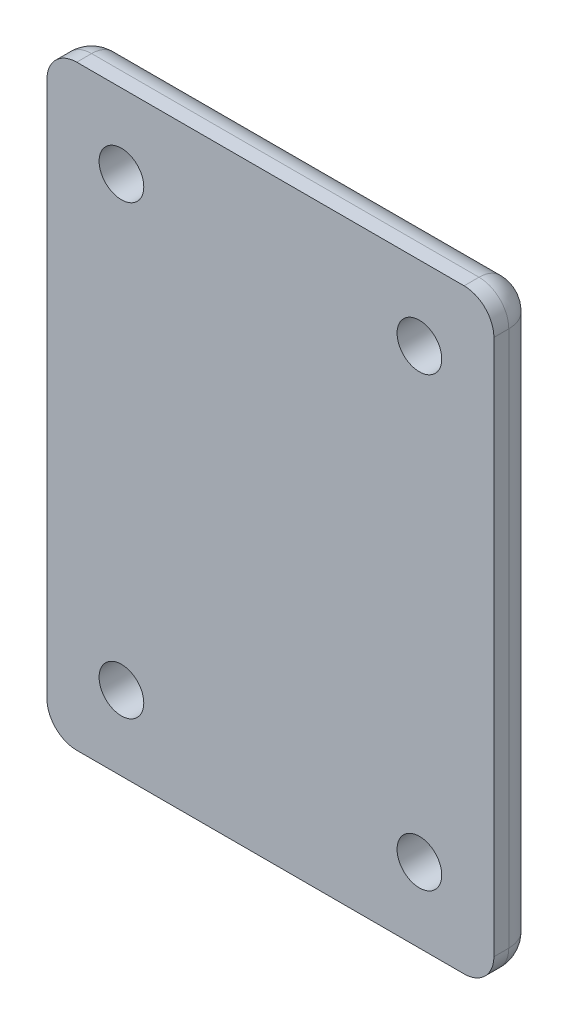
ISO-10303-21;
HEADER;
FILE_DESCRIPTION(('STEP AP214'),'2;1');
FILE_NAME('part.step','',(''),(''),'','','');
FILE_SCHEMA(('AUTOMOTIVE_DESIGN { 1 0 10303 214 1 1 1 1 }'));
ENDSEC;
DATA;
#1=APPLICATION_CONTEXT('core data for automotive mechanical design processes');
#2=APPLICATION_PROTOCOL_DEFINITION('international standard','automotive_design',2000,#1);
#3=PRODUCT_CONTEXT('',#1,'mechanical');
#4=PRODUCT('Part','Part','',(#3));
#5=PRODUCT_RELATED_PRODUCT_CATEGORY('part','',(#4));
#6=PRODUCT_DEFINITION_FORMATION('','',#4);
#7=PRODUCT_DEFINITION_CONTEXT('part definition',#1,'design');
#8=PRODUCT_DEFINITION('design','',#6,#7);
#9=PRODUCT_DEFINITION_SHAPE('','',#8);
#10=(LENGTH_UNIT() NAMED_UNIT(*) SI_UNIT(.MILLI.,.METRE.));
#11=(NAMED_UNIT(*) PLANE_ANGLE_UNIT() SI_UNIT($,.RADIAN.));
#12=(NAMED_UNIT(*) SI_UNIT($,.STERADIAN.) SOLID_ANGLE_UNIT());
#13=UNCERTAINTY_MEASURE_WITH_UNIT(LENGTH_MEASURE(1.E-05),#10,'distance_accuracy_value','');
#14=(GEOMETRIC_REPRESENTATION_CONTEXT(3) GLOBAL_UNCERTAINTY_ASSIGNED_CONTEXT((#13)) GLOBAL_UNIT_ASSIGNED_CONTEXT((#10,
#11,#12)) REPRESENTATION_CONTEXT('',''));
#15=CARTESIAN_POINT('',(0.,0.,0.));
#16=DIRECTION('',(0.,0.,1.));
#17=DIRECTION('',(1.,0.,0.));
#18=AXIS2_PLACEMENT_3D('',#15,#16,#17);
#19=CARTESIAN_POINT('',(15.,20.,3.));
#20=DIRECTION('',(-1.,0.,0.));
#21=DIRECTION('',(0.,-1.,0.));
#22=AXIS2_PLACEMENT_3D('',#19,#20,#21);
#23=PLANE('',#22);
#24=DIRECTION('',(0.,1.,0.));
#25=VECTOR('',#24,1.);
#26=CARTESIAN_POINT('',(15.,20.,3.));
#27=LINE('',#26,#25);
#28=CARTESIAN_POINT('',(15.,-18.,3.));
#29=VERTEX_POINT('',#28);
#30=CARTESIAN_POINT('',(15.,18.,3.));
#31=VERTEX_POINT('',#30);
#32=EDGE_CURVE('E125',#29,#31,#27,.T.);
#33=ORIENTED_EDGE('',*,*,#32,.F.);
#34=DIRECTION('',(0.,0.,-1.));
#35=VECTOR('',#34,1.);
#36=CARTESIAN_POINT('',(15.,-18.,3.));
#37=LINE('',#36,#35);
#38=CARTESIAN_POINT('',(15.,-18.,2.));
#39=VERTEX_POINT('',#38);
#40=EDGE_CURVE('E138',#29,#39,#37,.T.);
#41=ORIENTED_EDGE('',*,*,#40,.T.);
#42=DIRECTION('',(0.,1.,0.));
#43=VECTOR('',#42,1.);
#44=CARTESIAN_POINT('',(15.,20.,2.));
#45=LINE('',#44,#43);
#46=CARTESIAN_POINT('',(15.,18.,2.));
#47=VERTEX_POINT('',#46);
#48=EDGE_CURVE('E152',#39,#47,#45,.T.);
#49=ORIENTED_EDGE('',*,*,#48,.T.);
#50=DIRECTION('',(0.,0.,-1.));
#51=VECTOR('',#50,1.);
#52=CARTESIAN_POINT('',(15.,18.,3.));
#53=LINE('',#52,#51);
#54=EDGE_CURVE('E141',#47,#31,#53,.F.);
#55=ORIENTED_EDGE('',*,*,#54,.T.);
#56=EDGE_LOOP('',(#33,#41,#49,#55));
#57=FACE_BOUND('',#56,.T.);
#58=ADVANCED_FACE('F45',(#57),#23,.F.);
#59=CARTESIAN_POINT('',(-15.,20.,3.));
#60=DIRECTION('',(0.,-1.,0.));
#61=DIRECTION('',(0.,0.,-1.));
#62=AXIS2_PLACEMENT_3D('',#59,#60,#61);
#63=PLANE('',#62);
#64=DIRECTION('',(-1.,0.,0.));
#65=VECTOR('',#64,1.);
#66=CARTESIAN_POINT('',(-15.,20.,3.));
#67=LINE('',#66,#65);
#68=CARTESIAN_POINT('',(13.,20.,3.));
#69=VERTEX_POINT('',#68);
#70=CARTESIAN_POINT('',(-13.,20.,3.));
#71=VERTEX_POINT('',#70);
#72=EDGE_CURVE('E143',#69,#71,#67,.T.);
#73=ORIENTED_EDGE('',*,*,#72,.F.);
#74=DIRECTION('',(0.,0.,-1.));
#75=VECTOR('',#74,1.);
#76=CARTESIAN_POINT('',(13.,20.,3.));
#77=LINE('',#76,#75);
#78=CARTESIAN_POINT('',(13.,20.,2.));
#79=VERTEX_POINT('',#78);
#80=EDGE_CURVE('E11',#69,#79,#77,.T.);
#81=ORIENTED_EDGE('',*,*,#80,.T.);
#82=DIRECTION('',(-1.,0.,0.));
#83=VECTOR('',#82,1.);
#84=CARTESIAN_POINT('',(-15.,20.,2.));
#85=LINE('',#84,#83);
#86=CARTESIAN_POINT('',(-13.,20.,2.));
#87=VERTEX_POINT('',#86);
#88=EDGE_CURVE('E55',#79,#87,#85,.T.);
#89=ORIENTED_EDGE('',*,*,#88,.T.);
#90=DIRECTION('',(0.,0.,-1.));
#91=VECTOR('',#90,1.);
#92=CARTESIAN_POINT('',(-13.,20.,3.));
#93=LINE('',#92,#91);
#94=EDGE_CURVE('E195',#87,#71,#93,.F.);
#95=ORIENTED_EDGE('',*,*,#94,.T.);
#96=EDGE_LOOP('',(#73,#81,#89,#95));
#97=FACE_BOUND('',#96,.T.);
#98=ADVANCED_FACE('F308',(#97),#63,.F.);
#99=CARTESIAN_POINT('',(-15.,20.,3.));
#100=DIRECTION('',(1.,0.,0.));
#101=DIRECTION('',(0.,1.,0.));
#102=AXIS2_PLACEMENT_3D('',#99,#100,#101);
#103=PLANE('',#102);
#104=DIRECTION('',(0.,-1.,0.));
#105=VECTOR('',#104,1.);
#106=CARTESIAN_POINT('',(-15.,20.,2.));
#107=LINE('',#106,#105);
#108=CARTESIAN_POINT('',(-15.,18.,2.));
#109=VERTEX_POINT('',#108);
#110=CARTESIAN_POINT('',(-15.,-18.,2.));
#111=VERTEX_POINT('',#110);
#112=EDGE_CURVE('E189',#109,#111,#107,.T.);
#113=ORIENTED_EDGE('',*,*,#112,.T.);
#114=DIRECTION('',(0.,0.,-1.));
#115=VECTOR('',#114,1.);
#116=CARTESIAN_POINT('',(-15.,-18.,3.));
#117=LINE('',#116,#115);
#118=CARTESIAN_POINT('',(-15.,-18.,3.));
#119=VERTEX_POINT('',#118);
#120=EDGE_CURVE('E192',#111,#119,#117,.F.);
#121=ORIENTED_EDGE('',*,*,#120,.T.);
#122=DIRECTION('',(0.,-1.,0.));
#123=VECTOR('',#122,1.);
#124=CARTESIAN_POINT('',(-15.,20.,3.));
#125=LINE('',#124,#123);
#126=CARTESIAN_POINT('',(-15.,18.,3.));
#127=VERTEX_POINT('',#126);
#128=EDGE_CURVE('E267',#127,#119,#125,.T.);
#129=ORIENTED_EDGE('',*,*,#128,.F.);
#130=DIRECTION('',(0.,0.,-1.));
#131=VECTOR('',#130,1.);
#132=CARTESIAN_POINT('',(-15.,18.,3.));
#133=LINE('',#132,#131);
#134=EDGE_CURVE('E133',#127,#109,#133,.T.);
#135=ORIENTED_EDGE('',*,*,#134,.T.);
#136=EDGE_LOOP('',(#113,#121,#129,#135));
#137=FACE_BOUND('',#136,.T.);
#138=ADVANCED_FACE('F313',(#137),#103,.F.);
#139=CARTESIAN_POINT('',(-15.,-20.,3.));
#140=DIRECTION('',(0.,1.,0.));
#141=DIRECTION('',(0.,0.,1.));
#142=AXIS2_PLACEMENT_3D('',#139,#140,#141);
#143=PLANE('',#142);
#144=DIRECTION('',(1.,0.,0.));
#145=VECTOR('',#144,1.);
#146=CARTESIAN_POINT('',(-15.,-20.,2.));
#147=LINE('',#146,#145);
#148=CARTESIAN_POINT('',(-13.,-20.,2.));
#149=VERTEX_POINT('',#148);
#150=CARTESIAN_POINT('',(13.,-20.,2.));
#151=VERTEX_POINT('',#150);
#152=EDGE_CURVE('E173',#149,#151,#147,.T.);
#153=ORIENTED_EDGE('',*,*,#152,.T.);
#154=DIRECTION('',(0.,0.,-1.));
#155=VECTOR('',#154,1.);
#156=CARTESIAN_POINT('',(13.,-20.,3.));
#157=LINE('',#156,#155);
#158=CARTESIAN_POINT('',(13.,-20.,3.));
#159=VERTEX_POINT('',#158);
#160=EDGE_CURVE('E176',#151,#159,#157,.F.);
#161=ORIENTED_EDGE('',*,*,#160,.T.);
#162=DIRECTION('',(1.,0.,0.));
#163=VECTOR('',#162,1.);
#164=CARTESIAN_POINT('',(-15.,-20.,3.));
#165=LINE('',#164,#163);
#166=CARTESIAN_POINT('',(-13.,-20.,3.));
#167=VERTEX_POINT('',#166);
#168=EDGE_CURVE('E128',#167,#159,#165,.T.);
#169=ORIENTED_EDGE('',*,*,#168,.F.);
#170=DIRECTION('',(0.,0.,-1.));
#171=VECTOR('',#170,1.);
#172=CARTESIAN_POINT('',(-13.,-20.,3.));
#173=LINE('',#172,#171);
#174=EDGE_CURVE('E170',#167,#149,#173,.T.);
#175=ORIENTED_EDGE('',*,*,#174,.T.);
#176=EDGE_LOOP('',(#153,#161,#169,#175));
#177=FACE_BOUND('',#176,.T.);
#178=ADVANCED_FACE('F377',(#177),#143,.F.);
#179=CARTESIAN_POINT('',(0.,0.,3.));
#180=DIRECTION('',(0.,0.,1.));
#181=DIRECTION('',(1.,0.,0.));
#182=AXIS2_PLACEMENT_3D('',#179,#180,#181);
#183=PLANE('',#182);
#184=CARTESIAN_POINT('',(-10.,15.,3.));
#185=DIRECTION('',(0.,0.,1.));
#186=DIRECTION('',(1.,0.,0.));
#187=AXIS2_PLACEMENT_3D('',#184,#185,#186);
#188=CIRCLE('',#187,1.5);
#189=CARTESIAN_POINT('',(-8.5,15.,3.));
#190=VERTEX_POINT('',#189);
#191=EDGE_CURVE('E253',#190,#190,#188,.T.);
#192=ORIENTED_EDGE('',*,*,#191,.F.);
#193=EDGE_LOOP('',(#192));
#194=FACE_BOUND('',#193,.T.);
#195=CARTESIAN_POINT('',(10.,-15.,3.));
#196=DIRECTION('',(0.,0.,1.));
#197=DIRECTION('',(1.,0.,0.));
#198=AXIS2_PLACEMENT_3D('',#195,#196,#197);
#199=CIRCLE('',#198,1.5);
#200=CARTESIAN_POINT('',(11.5,-15.,3.));
#201=VERTEX_POINT('',#200);
#202=EDGE_CURVE('E247',#201,#201,#199,.T.);
#203=ORIENTED_EDGE('',*,*,#202,.F.);
#204=EDGE_LOOP('',(#203));
#205=FACE_BOUND('',#204,.T.);
#206=CARTESIAN_POINT('',(-10.,-15.,3.));
#207=DIRECTION('',(0.,0.,1.));
#208=DIRECTION('',(1.,0.,0.));
#209=AXIS2_PLACEMENT_3D('',#206,#207,#208);
#210=CIRCLE('',#209,1.5);
#211=CARTESIAN_POINT('',(-8.5,-15.,3.));
#212=VERTEX_POINT('',#211);
#213=EDGE_CURVE('E243',#212,#212,#210,.T.);
#214=ORIENTED_EDGE('',*,*,#213,.F.);
#215=EDGE_LOOP('',(#214));
#216=FACE_BOUND('',#215,.T.);
#217=CARTESIAN_POINT('',(10.,15.,3.));
#218=DIRECTION('',(0.,0.,1.));
#219=DIRECTION('',(1.,0.,0.));
#220=AXIS2_PLACEMENT_3D('',#217,#218,#219);
#221=CIRCLE('',#220,1.5);
#222=CARTESIAN_POINT('',(11.5,15.,3.));
#223=VERTEX_POINT('',#222);
#224=EDGE_CURVE('E258',#223,#223,#221,.T.);
#225=ORIENTED_EDGE('',*,*,#224,.F.);
#226=EDGE_LOOP('',(#225));
#227=FACE_BOUND('',#226,.T.);
#228=ORIENTED_EDGE('',*,*,#168,.T.);
#229=CARTESIAN_POINT('',(13.,-18.,3.));
#230=DIRECTION('',(0.,0.,1.));
#231=DIRECTION('',(1.,0.,0.));
#232=AXIS2_PLACEMENT_3D('',#229,#230,#231);
#233=CIRCLE('',#232,2.);
#234=EDGE_CURVE('E122',#159,#29,#233,.T.);
#235=ORIENTED_EDGE('',*,*,#234,.T.);
#236=ORIENTED_EDGE('',*,*,#32,.T.);
#237=CARTESIAN_POINT('',(13.,18.,3.));
#238=DIRECTION('',(0.,0.,1.));
#239=DIRECTION('',(1.,0.,0.));
#240=AXIS2_PLACEMENT_3D('',#237,#238,#239);
#241=CIRCLE('',#240,2.);
#242=EDGE_CURVE('E182',#31,#69,#241,.T.);
#243=ORIENTED_EDGE('',*,*,#242,.T.);
#244=ORIENTED_EDGE('',*,*,#72,.T.);
#245=CARTESIAN_POINT('',(-13.,18.,3.));
#246=DIRECTION('',(0.,0.,1.));
#247=DIRECTION('',(1.,0.,0.));
#248=AXIS2_PLACEMENT_3D('',#245,#246,#247);
#249=CIRCLE('',#248,2.);
#250=EDGE_CURVE('E179',#71,#127,#249,.T.);
#251=ORIENTED_EDGE('',*,*,#250,.T.);
#252=ORIENTED_EDGE('',*,*,#128,.T.);
#253=CARTESIAN_POINT('',(-13.,-18.,3.));
#254=DIRECTION('',(0.,0.,1.));
#255=DIRECTION('',(1.,0.,0.));
#256=AXIS2_PLACEMENT_3D('',#253,#254,#255);
#257=CIRCLE('',#256,2.);
#258=EDGE_CURVE('E134',#119,#167,#257,.T.);
#259=ORIENTED_EDGE('',*,*,#258,.T.);
#260=EDGE_LOOP('',(#228,#235,#236,#243,#244,#251,#252,#259));
#261=FACE_BOUND('',#260,.T.);
#262=ADVANCED_FACE('F124',(#194,#205,#216,#227,#261),#183,.T.);
#263=CARTESIAN_POINT('',(0.,0.,0.));
#264=DIRECTION('',(0.,0.,1.));
#265=DIRECTION('',(1.,0.,0.));
#266=AXIS2_PLACEMENT_3D('',#263,#264,#265);
#267=PLANE('',#266);
#268=DIRECTION('',(-1.,0.,0.));
#269=VECTOR('',#268,1.);
#270=CARTESIAN_POINT('',(0.,18.,0.));
#271=LINE('',#270,#269);
#272=CARTESIAN_POINT('',(-13.,18.,0.));
#273=VERTEX_POINT('',#272);
#274=CARTESIAN_POINT('',(13.,18.,0.));
#275=VERTEX_POINT('',#274);
#276=EDGE_CURVE('E151',#273,#275,#271,.F.);
#277=ORIENTED_EDGE('',*,*,#276,.T.);
#278=DIRECTION('',(0.,1.,0.));
#279=VECTOR('',#278,1.);
#280=CARTESIAN_POINT('',(13.,0.,0.));
#281=LINE('',#280,#279);
#282=CARTESIAN_POINT('',(13.,-18.,0.));
#283=VERTEX_POINT('',#282);
#284=EDGE_CURVE('E166',#275,#283,#281,.F.);
#285=ORIENTED_EDGE('',*,*,#284,.T.);
#286=DIRECTION('',(1.,0.,0.));
#287=VECTOR('',#286,1.);
#288=CARTESIAN_POINT('',(0.,-18.,0.));
#289=LINE('',#288,#287);
#290=CARTESIAN_POINT('',(-13.,-18.,0.));
#291=VERTEX_POINT('',#290);
#292=EDGE_CURVE('E163',#283,#291,#289,.F.);
#293=ORIENTED_EDGE('',*,*,#292,.T.);
#294=DIRECTION('',(0.,-1.,0.));
#295=VECTOR('',#294,1.);
#296=CARTESIAN_POINT('',(-13.,0.,0.));
#297=LINE('',#296,#295);
#298=EDGE_CURVE('E156',#291,#273,#297,.F.);
#299=ORIENTED_EDGE('',*,*,#298,.T.);
#300=EDGE_LOOP('',(#277,#285,#293,#299));
#301=FACE_BOUND('',#300,.T.);
#302=CARTESIAN_POINT('',(-10.,15.,0.));
#303=DIRECTION('',(0.,0.,1.));
#304=DIRECTION('',(1.,0.,0.));
#305=AXIS2_PLACEMENT_3D('',#302,#303,#304);
#306=CIRCLE('',#305,1.5);
#307=CARTESIAN_POINT('',(-8.5,15.,0.));
#308=VERTEX_POINT('',#307);
#309=EDGE_CURVE('E144',#308,#308,#306,.T.);
#310=ORIENTED_EDGE('',*,*,#309,.T.);
#311=EDGE_LOOP('',(#310));
#312=FACE_BOUND('',#311,.T.);
#313=CARTESIAN_POINT('',(10.,-15.,0.));
#314=DIRECTION('',(0.,0.,1.));
#315=DIRECTION('',(1.,0.,0.));
#316=AXIS2_PLACEMENT_3D('',#313,#314,#315);
#317=CIRCLE('',#316,1.5);
#318=CARTESIAN_POINT('',(11.5,-15.,0.));
#319=VERTEX_POINT('',#318);
#320=EDGE_CURVE('E280',#319,#319,#317,.T.);
#321=ORIENTED_EDGE('',*,*,#320,.T.);
#322=EDGE_LOOP('',(#321));
#323=FACE_BOUND('',#322,.T.);
#324=CARTESIAN_POINT('',(-10.,-15.,0.));
#325=DIRECTION('',(0.,0.,1.));
#326=DIRECTION('',(1.,0.,0.));
#327=AXIS2_PLACEMENT_3D('',#324,#325,#326);
#328=CIRCLE('',#327,1.5);
#329=CARTESIAN_POINT('',(-8.5,-15.,0.));
#330=VERTEX_POINT('',#329);
#331=EDGE_CURVE('E276',#330,#330,#328,.T.);
#332=ORIENTED_EDGE('',*,*,#331,.T.);
#333=EDGE_LOOP('',(#332));
#334=FACE_BOUND('',#333,.T.);
#335=CARTESIAN_POINT('',(10.,15.,0.));
#336=DIRECTION('',(0.,0.,1.));
#337=DIRECTION('',(1.,0.,0.));
#338=AXIS2_PLACEMENT_3D('',#335,#336,#337);
#339=CIRCLE('',#338,1.5);
#340=CARTESIAN_POINT('',(11.5,15.,0.));
#341=VERTEX_POINT('',#340);
#342=EDGE_CURVE('E262',#341,#341,#339,.T.);
#343=ORIENTED_EDGE('',*,*,#342,.T.);
#344=EDGE_LOOP('',(#343));
#345=FACE_BOUND('',#344,.T.);
#346=ADVANCED_FACE('F289',(#301,#312,#323,#334,#345),#267,.F.);
#347=CARTESIAN_POINT('',(10.,15.,-7.));
#348=DIRECTION('',(0.,0.,1.));
#349=DIRECTION('',(1.,0.,0.));
#350=AXIS2_PLACEMENT_3D('',#347,#348,#349);
#351=CYLINDRICAL_SURFACE('',#350,1.5);
#352=ORIENTED_EDGE('',*,*,#224,.T.);
#353=EDGE_LOOP('',(#352));
#354=FACE_BOUND('',#353,.T.);
#355=ORIENTED_EDGE('',*,*,#342,.F.);
#356=EDGE_LOOP('',(#355));
#357=FACE_BOUND('',#356,.T.);
#358=ADVANCED_FACE('F388',(#354,#357),#351,.F.);
#359=CARTESIAN_POINT('',(-10.,-15.,-7.));
#360=DIRECTION('',(0.,0.,1.));
#361=DIRECTION('',(1.,0.,0.));
#362=AXIS2_PLACEMENT_3D('',#359,#360,#361);
#363=CYLINDRICAL_SURFACE('',#362,1.5);
#364=ORIENTED_EDGE('',*,*,#213,.T.);
#365=EDGE_LOOP('',(#364));
#366=FACE_BOUND('',#365,.T.);
#367=ORIENTED_EDGE('',*,*,#331,.F.);
#368=EDGE_LOOP('',(#367));
#369=FACE_BOUND('',#368,.T.);
#370=ADVANCED_FACE('F304',(#366,#369),#363,.F.);
#371=CARTESIAN_POINT('',(10.,-15.,-7.));
#372=DIRECTION('',(0.,0.,1.));
#373=DIRECTION('',(1.,0.,0.));
#374=AXIS2_PLACEMENT_3D('',#371,#372,#373);
#375=CYLINDRICAL_SURFACE('',#374,1.5);
#376=ORIENTED_EDGE('',*,*,#202,.T.);
#377=EDGE_LOOP('',(#376));
#378=FACE_BOUND('',#377,.T.);
#379=ORIENTED_EDGE('',*,*,#320,.F.);
#380=EDGE_LOOP('',(#379));
#381=FACE_BOUND('',#380,.T.);
#382=ADVANCED_FACE('F294',(#378,#381),#375,.F.);
#383=CARTESIAN_POINT('',(-10.,15.,-7.));
#384=DIRECTION('',(0.,0.,1.));
#385=DIRECTION('',(1.,0.,0.));
#386=AXIS2_PLACEMENT_3D('',#383,#384,#385);
#387=CYLINDRICAL_SURFACE('',#386,1.5);
#388=ORIENTED_EDGE('',*,*,#191,.T.);
#389=EDGE_LOOP('',(#388));
#390=FACE_BOUND('',#389,.T.);
#391=ORIENTED_EDGE('',*,*,#309,.F.);
#392=EDGE_LOOP('',(#391));
#393=FACE_BOUND('',#392,.T.);
#394=ADVANCED_FACE('F292',(#390,#393),#387,.F.);
#395=CARTESIAN_POINT('',(-13.,-18.,3.));
#396=DIRECTION('',(0.,0.,-1.));
#397=DIRECTION('',(-1.,0.,0.));
#398=AXIS2_PLACEMENT_3D('',#395,#396,#397);
#399=CYLINDRICAL_SURFACE('',#398,2.);
#400=ORIENTED_EDGE('',*,*,#258,.F.);
#401=ORIENTED_EDGE('',*,*,#120,.F.);
#402=CARTESIAN_POINT('',(-13.,-18.,2.));
#403=DIRECTION('',(0.,0.,-1.));
#404=DIRECTION('',(-1.,0.,0.));
#405=AXIS2_PLACEMENT_3D('',#402,#403,#404);
#406=CIRCLE('',#405,2.);
#407=EDGE_CURVE('E235',#149,#111,#406,.T.);
#408=ORIENTED_EDGE('',*,*,#407,.F.);
#409=ORIENTED_EDGE('',*,*,#174,.F.);
#410=EDGE_LOOP('',(#400,#401,#408,#409));
#411=FACE_BOUND('',#410,.T.);
#412=ADVANCED_FACE('F47',(#411),#399,.T.);
#413=CARTESIAN_POINT('',(-13.,18.,3.));
#414=DIRECTION('',(0.,0.,-1.));
#415=DIRECTION('',(-1.,0.,0.));
#416=AXIS2_PLACEMENT_3D('',#413,#414,#415);
#417=CYLINDRICAL_SURFACE('',#416,2.);
#418=ORIENTED_EDGE('',*,*,#250,.F.);
#419=ORIENTED_EDGE('',*,*,#94,.F.);
#420=CARTESIAN_POINT('',(-13.,18.,2.));
#421=DIRECTION('',(0.,0.,-1.));
#422=DIRECTION('',(-1.,0.,0.));
#423=AXIS2_PLACEMENT_3D('',#420,#421,#422);
#424=CIRCLE('',#423,2.);
#425=EDGE_CURVE('E232',#109,#87,#424,.T.);
#426=ORIENTED_EDGE('',*,*,#425,.F.);
#427=ORIENTED_EDGE('',*,*,#134,.F.);
#428=EDGE_LOOP('',(#418,#419,#426,#427));
#429=FACE_BOUND('',#428,.T.);
#430=ADVANCED_FACE('F302',(#429),#417,.T.);
#431=CARTESIAN_POINT('',(-13.,20.,2.));
#432=DIRECTION('',(0.,-1.,0.));
#433=DIRECTION('',(1.,0.,0.));
#434=AXIS2_PLACEMENT_3D('',#431,#432,#433);
#435=CYLINDRICAL_SURFACE('',#434,2.);
#436=CARTESIAN_POINT('',(-13.,-18.,2.));
#437=DIRECTION('',(0.,-1.,0.));
#438=DIRECTION('',(0.,0.,-1.));
#439=AXIS2_PLACEMENT_3D('',#436,#437,#438);
#440=CIRCLE('',#439,2.);
#441=EDGE_CURVE('E49',#111,#291,#440,.T.);
#442=ORIENTED_EDGE('',*,*,#441,.F.);
#443=ORIENTED_EDGE('',*,*,#112,.F.);
#444=CARTESIAN_POINT('',(-13.,18.,2.));
#445=DIRECTION('',(0.,1.,0.));
#446=DIRECTION('',(0.,0.,1.));
#447=AXIS2_PLACEMENT_3D('',#444,#445,#446);
#448=CIRCLE('',#447,2.);
#449=EDGE_CURVE('E228',#273,#109,#448,.T.);
#450=ORIENTED_EDGE('',*,*,#449,.F.);
#451=ORIENTED_EDGE('',*,*,#298,.F.);
#452=EDGE_LOOP('',(#442,#443,#450,#451));
#453=FACE_BOUND('',#452,.T.);
#454=ADVANCED_FACE('F350',(#453),#435,.T.);
#455=CARTESIAN_POINT('',(-13.,-18.,2.));
#456=DIRECTION('',(-1.,0.,0.));
#457=DIRECTION('',(0.,0.,1.));
#458=AXIS2_PLACEMENT_3D('',#455,#456,#457);
#459=SPHERICAL_SURFACE('',#458,2.);
#460=ORIENTED_EDGE('',*,*,#407,.T.);
#461=ORIENTED_EDGE('',*,*,#441,.T.);
#462=CARTESIAN_POINT('',(-13.,-18.,2.));
#463=DIRECTION('',(-1.,0.,0.));
#464=DIRECTION('',(0.,0.,1.));
#465=AXIS2_PLACEMENT_3D('',#462,#463,#464);
#466=CIRCLE('',#465,2.);
#467=EDGE_CURVE('E224',#149,#291,#466,.F.);
#468=ORIENTED_EDGE('',*,*,#467,.F.);
#469=EDGE_LOOP('',(#460,#461,#468));
#470=FACE_BOUND('',#469,.T.);
#471=ADVANCED_FACE('F346',(#470),#459,.T.);
#472=CARTESIAN_POINT('',(-13.,18.,2.));
#473=DIRECTION('',(-1.,0.,0.));
#474=DIRECTION('',(0.,0.,1.));
#475=AXIS2_PLACEMENT_3D('',#472,#473,#474);
#476=SPHERICAL_SURFACE('',#475,2.);
#477=ORIENTED_EDGE('',*,*,#449,.T.);
#478=ORIENTED_EDGE('',*,*,#425,.T.);
#479=CARTESIAN_POINT('',(-13.,18.,2.));
#480=DIRECTION('',(-1.,0.,0.));
#481=DIRECTION('',(0.,0.,1.));
#482=AXIS2_PLACEMENT_3D('',#479,#480,#481);
#483=CIRCLE('',#482,2.);
#484=EDGE_CURVE('E220',#273,#87,#483,.F.);
#485=ORIENTED_EDGE('',*,*,#484,.F.);
#486=EDGE_LOOP('',(#477,#478,#485));
#487=FACE_BOUND('',#486,.T.);
#488=ADVANCED_FACE('F342',(#487),#476,.T.);
#489=CARTESIAN_POINT('',(-15.,-18.,2.));
#490=DIRECTION('',(1.,0.,0.));
#491=DIRECTION('',(0.,0.,-1.));
#492=AXIS2_PLACEMENT_3D('',#489,#490,#491);
#493=CYLINDRICAL_SURFACE('',#492,2.);
#494=ORIENTED_EDGE('',*,*,#467,.T.);
#495=ORIENTED_EDGE('',*,*,#292,.F.);
#496=CARTESIAN_POINT('',(13.,-18.,2.));
#497=DIRECTION('',(1.,0.,0.));
#498=DIRECTION('',(0.,0.,-1.));
#499=AXIS2_PLACEMENT_3D('',#496,#497,#498);
#500=CIRCLE('',#499,2.);
#501=EDGE_CURVE('E216',#151,#283,#500,.T.);
#502=ORIENTED_EDGE('',*,*,#501,.F.);
#503=ORIENTED_EDGE('',*,*,#152,.F.);
#504=EDGE_LOOP('',(#494,#495,#502,#503));
#505=FACE_BOUND('',#504,.T.);
#506=ADVANCED_FACE('F339',(#505),#493,.T.);
#507=CARTESIAN_POINT('',(13.,-18.,3.));
#508=DIRECTION('',(0.,0.,-1.));
#509=DIRECTION('',(-1.,0.,0.));
#510=AXIS2_PLACEMENT_3D('',#507,#508,#509);
#511=CYLINDRICAL_SURFACE('',#510,2.);
#512=ORIENTED_EDGE('',*,*,#234,.F.);
#513=ORIENTED_EDGE('',*,*,#160,.F.);
#514=CARTESIAN_POINT('',(13.,-18.,2.));
#515=DIRECTION('',(0.,0.,-1.));
#516=DIRECTION('',(-1.,0.,0.));
#517=AXIS2_PLACEMENT_3D('',#514,#515,#516);
#518=CIRCLE('',#517,2.);
#519=EDGE_CURVE('E148',#39,#151,#518,.T.);
#520=ORIENTED_EDGE('',*,*,#519,.F.);
#521=ORIENTED_EDGE('',*,*,#40,.F.);
#522=EDGE_LOOP('',(#512,#513,#520,#521));
#523=FACE_BOUND('',#522,.T.);
#524=ADVANCED_FACE('F146',(#523),#511,.T.);
#525=CARTESIAN_POINT('',(13.,18.,3.));
#526=DIRECTION('',(0.,0.,-1.));
#527=DIRECTION('',(-1.,0.,0.));
#528=AXIS2_PLACEMENT_3D('',#525,#526,#527);
#529=CYLINDRICAL_SURFACE('',#528,2.);
#530=ORIENTED_EDGE('',*,*,#242,.F.);
#531=ORIENTED_EDGE('',*,*,#54,.F.);
#532=CARTESIAN_POINT('',(13.,18.,2.));
#533=DIRECTION('',(0.,0.,-1.));
#534=DIRECTION('',(-1.,0.,0.));
#535=AXIS2_PLACEMENT_3D('',#532,#533,#534);
#536=CIRCLE('',#535,2.);
#537=EDGE_CURVE('E210',#79,#47,#536,.T.);
#538=ORIENTED_EDGE('',*,*,#537,.F.);
#539=ORIENTED_EDGE('',*,*,#80,.F.);
#540=EDGE_LOOP('',(#530,#531,#538,#539));
#541=FACE_BOUND('',#540,.T.);
#542=ADVANCED_FACE('F332',(#541),#529,.T.);
#543=CARTESIAN_POINT('',(-15.,18.,2.));
#544=DIRECTION('',(-1.,0.,0.));
#545=DIRECTION('',(0.,0.,1.));
#546=AXIS2_PLACEMENT_3D('',#543,#544,#545);
#547=CYLINDRICAL_SURFACE('',#546,2.);
#548=ORIENTED_EDGE('',*,*,#484,.T.);
#549=ORIENTED_EDGE('',*,*,#88,.F.);
#550=CARTESIAN_POINT('',(13.,18.,2.));
#551=DIRECTION('',(1.,0.,0.));
#552=DIRECTION('',(0.,1.,0.));
#553=AXIS2_PLACEMENT_3D('',#550,#551,#552);
#554=CIRCLE('',#553,2.);
#555=EDGE_CURVE('E206',#275,#79,#554,.T.);
#556=ORIENTED_EDGE('',*,*,#555,.F.);
#557=ORIENTED_EDGE('',*,*,#276,.F.);
#558=EDGE_LOOP('',(#548,#549,#556,#557));
#559=FACE_BOUND('',#558,.T.);
#560=ADVANCED_FACE('F328',(#559),#547,.T.);
#561=CARTESIAN_POINT('',(13.,-18.,2.));
#562=DIRECTION('',(0.,-1.,0.));
#563=DIRECTION('',(0.,0.,-1.));
#564=AXIS2_PLACEMENT_3D('',#561,#562,#563);
#565=SPHERICAL_SURFACE('',#564,2.);
#566=ORIENTED_EDGE('',*,*,#519,.T.);
#567=ORIENTED_EDGE('',*,*,#501,.T.);
#568=CARTESIAN_POINT('',(13.,-18.,2.));
#569=DIRECTION('',(0.,-1.,0.));
#570=DIRECTION('',(1.,0.,0.));
#571=AXIS2_PLACEMENT_3D('',#568,#569,#570);
#572=CIRCLE('',#571,2.);
#573=EDGE_CURVE('E203',#39,#283,#572,.F.);
#574=ORIENTED_EDGE('',*,*,#573,.F.);
#575=EDGE_LOOP('',(#566,#567,#574));
#576=FACE_BOUND('',#575,.T.);
#577=ADVANCED_FACE('F324',(#576),#565,.T.);
#578=CARTESIAN_POINT('',(13.,18.,2.));
#579=DIRECTION('',(0.,1.,0.));
#580=DIRECTION('',(-1.,0.,0.));
#581=AXIS2_PLACEMENT_3D('',#578,#579,#580);
#582=SPHERICAL_SURFACE('',#581,2.);
#583=ORIENTED_EDGE('',*,*,#555,.T.);
#584=ORIENTED_EDGE('',*,*,#537,.T.);
#585=CARTESIAN_POINT('',(13.,18.,2.));
#586=DIRECTION('',(0.,1.,0.));
#587=DIRECTION('',(0.,0.,1.));
#588=AXIS2_PLACEMENT_3D('',#585,#586,#587);
#589=CIRCLE('',#588,2.);
#590=EDGE_CURVE('E200',#275,#47,#589,.F.);
#591=ORIENTED_EDGE('',*,*,#590,.F.);
#592=EDGE_LOOP('',(#583,#584,#591));
#593=FACE_BOUND('',#592,.T.);
#594=ADVANCED_FACE('F320',(#593),#582,.T.);
#595=CARTESIAN_POINT('',(13.,20.,2.));
#596=DIRECTION('',(0.,1.,0.));
#597=DIRECTION('',(-1.,0.,0.));
#598=AXIS2_PLACEMENT_3D('',#595,#596,#597);
#599=CYLINDRICAL_SURFACE('',#598,2.);
#600=ORIENTED_EDGE('',*,*,#573,.T.);
#601=ORIENTED_EDGE('',*,*,#284,.F.);
#602=ORIENTED_EDGE('',*,*,#590,.T.);
#603=ORIENTED_EDGE('',*,*,#48,.F.);
#604=EDGE_LOOP('',(#600,#601,#602,#603));
#605=FACE_BOUND('',#604,.T.);
#606=ADVANCED_FACE('F317',(#605),#599,.T.);
#607=CLOSED_SHELL('',(#58,#98,#138,#178,#262,#346,#358,#370,#382,#394,#412,#430,#454,#471,#488,
#506,#524,#542,#560,#577,#594,#606));
#608=MANIFOLD_SOLID_BREP('B2',#607);
#609=ADVANCED_BREP_SHAPE_REPRESENTATION('',(#18,#608),#14);
#610=SHAPE_DEFINITION_REPRESENTATION(#9,#609);
ENDSEC;
END-ISO-10303-21;
